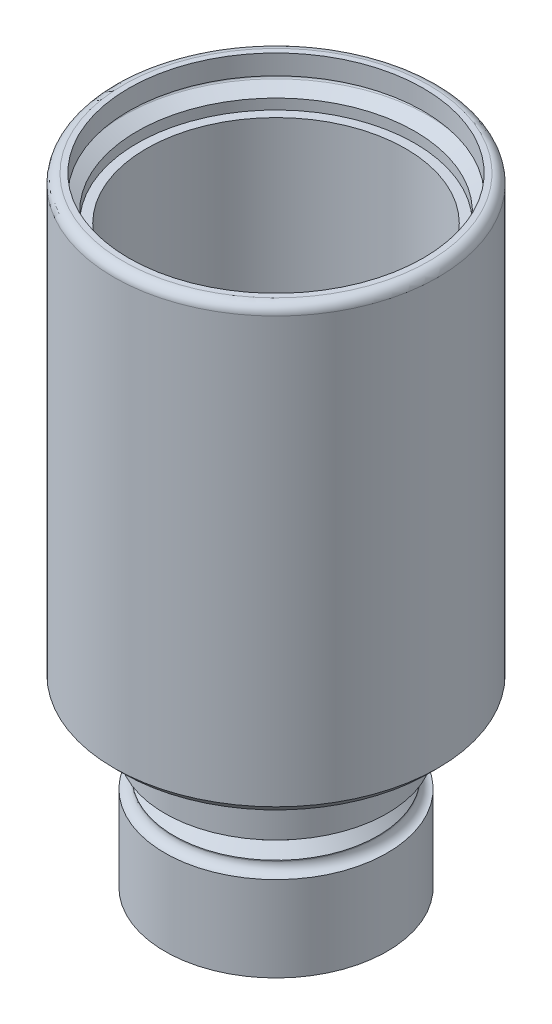
ISO-10303-21;
HEADER;
FILE_DESCRIPTION(('STEP AP214'),'2;1');
FILE_NAME('part.step','',(''),(''),'','','');
FILE_SCHEMA(('AUTOMOTIVE_DESIGN { 1 0 10303 214 1 1 1 1 }'));
ENDSEC;
DATA;
#1=APPLICATION_CONTEXT('core data for automotive mechanical design processes');
#2=APPLICATION_PROTOCOL_DEFINITION('international standard','automotive_design',2000,#1);
#3=PRODUCT_CONTEXT('',#1,'mechanical');
#4=PRODUCT('Part','Part','',(#3));
#5=PRODUCT_RELATED_PRODUCT_CATEGORY('part','',(#4));
#6=PRODUCT_DEFINITION_FORMATION('','',#4);
#7=PRODUCT_DEFINITION_CONTEXT('part definition',#1,'design');
#8=PRODUCT_DEFINITION('design','',#6,#7);
#9=PRODUCT_DEFINITION_SHAPE('','',#8);
#10=(LENGTH_UNIT() NAMED_UNIT(*) SI_UNIT(.MILLI.,.METRE.));
#11=(NAMED_UNIT(*) PLANE_ANGLE_UNIT() SI_UNIT($,.RADIAN.));
#12=(NAMED_UNIT(*) SI_UNIT($,.STERADIAN.) SOLID_ANGLE_UNIT());
#13=UNCERTAINTY_MEASURE_WITH_UNIT(LENGTH_MEASURE(1.E-05),#10,'distance_accuracy_value','');
#14=(GEOMETRIC_REPRESENTATION_CONTEXT(3) GLOBAL_UNCERTAINTY_ASSIGNED_CONTEXT((#13)) GLOBAL_UNIT_ASSIGNED_CONTEXT((#10,
#11,#12)) REPRESENTATION_CONTEXT('',''));
#15=CARTESIAN_POINT('',(0.,0.,0.));
#16=DIRECTION('',(0.,0.,1.));
#17=DIRECTION('',(1.,0.,0.));
#18=AXIS2_PLACEMENT_3D('',#15,#16,#17);
#19=CARTESIAN_POINT('',(-9.75,4.8,0.));
#20=DIRECTION('',(0.,1.,0.));
#21=DIRECTION('',(0.,0.,1.));
#22=AXIS2_PLACEMENT_3D('',#19,#20,#21);
#23=PLANE('',#22);
#24=CARTESIAN_POINT('',(0.,4.8,0.));
#25=DIRECTION('',(0.,1.,0.));
#26=DIRECTION('',(0.,0.,1.));
#27=AXIS2_PLACEMENT_3D('',#24,#25,#26);
#28=CIRCLE('',#27,9.35);
#29=CARTESIAN_POINT('',(0.,4.8,9.35));
#30=VERTEX_POINT('',#29);
#31=EDGE_CURVE('E106',#30,#30,#28,.F.);
#32=ORIENTED_EDGE('',*,*,#31,.T.);
#33=EDGE_LOOP('',(#32));
#34=FACE_BOUND('',#33,.T.);
#35=CARTESIAN_POINT('',(0.,4.8,0.));
#36=DIRECTION('',(0.,1.,0.));
#37=DIRECTION('',(0.,0.,1.));
#38=AXIS2_PLACEMENT_3D('',#35,#36,#37);
#39=CIRCLE('',#38,7.7);
#40=CARTESIAN_POINT('',(0.,4.8,7.7));
#41=VERTEX_POINT('',#40);
#42=EDGE_CURVE('E115',#41,#41,#39,.T.);
#43=ORIENTED_EDGE('',*,*,#42,.T.);
#44=EDGE_LOOP('',(#43));
#45=FACE_BOUND('',#44,.T.);
#46=ADVANCED_FACE('F35',(#34,#45),#23,.F.);
#47=CARTESIAN_POINT('',(0.,0.,0.));
#48=DIRECTION('',(0.,-1.,0.));
#49=DIRECTION('',(0.,0.,-1.));
#50=AXIS2_PLACEMENT_3D('',#47,#48,#49);
#51=CYLINDRICAL_SURFACE('',#50,7.5);
#52=CARTESIAN_POINT('',(0.,6.1,0.));
#53=DIRECTION('',(0.,-1.,0.));
#54=DIRECTION('',(0.,0.,-1.));
#55=AXIS2_PLACEMENT_3D('',#52,#53,#54);
#56=CIRCLE('',#55,7.5);
#57=CARTESIAN_POINT('',(0.,6.1,-7.5));
#58=VERTEX_POINT('',#57);
#59=EDGE_CURVE('E118',#58,#58,#56,.F.);
#60=ORIENTED_EDGE('',*,*,#59,.T.);
#61=EDGE_LOOP('',(#60));
#62=FACE_BOUND('',#61,.T.);
#63=CARTESIAN_POINT('',(0.,5.,0.));
#64=DIRECTION('',(0.,1.,0.));
#65=DIRECTION('',(0.,0.,1.));
#66=AXIS2_PLACEMENT_3D('',#63,#64,#65);
#67=CIRCLE('',#66,7.5);
#68=CARTESIAN_POINT('',(0.,5.,7.5));
#69=VERTEX_POINT('',#68);
#70=EDGE_CURVE('E121',#69,#69,#67,.F.);
#71=ORIENTED_EDGE('',*,*,#70,.T.);
#72=EDGE_LOOP('',(#71));
#73=FACE_BOUND('',#72,.T.);
#74=ADVANCED_FACE('F282',(#62,#73),#51,.F.);
#75=CARTESIAN_POINT('',(-7.5,6.3,0.));
#76=DIRECTION('',(0.,-1.,0.));
#77=DIRECTION('',(0.,0.,-1.));
#78=AXIS2_PLACEMENT_3D('',#75,#76,#77);
#79=PLANE('',#78);
#80=CARTESIAN_POINT('',(0.,6.3,0.));
#81=DIRECTION('',(0.,-1.,0.));
#82=DIRECTION('',(0.,0.,-1.));
#83=AXIS2_PLACEMENT_3D('',#80,#81,#82);
#84=CIRCLE('',#83,9.35);
#85=CARTESIAN_POINT('',(0.,6.3,-9.35));
#86=VERTEX_POINT('',#85);
#87=EDGE_CURVE('E88',#86,#86,#84,.F.);
#88=ORIENTED_EDGE('',*,*,#87,.T.);
#89=EDGE_LOOP('',(#88));
#90=FACE_BOUND('',#89,.T.);
#91=CARTESIAN_POINT('',(0.,6.3,0.));
#92=DIRECTION('',(0.,-1.,0.));
#93=DIRECTION('',(0.,0.,-1.));
#94=AXIS2_PLACEMENT_3D('',#91,#92,#93);
#95=CIRCLE('',#94,7.7);
#96=CARTESIAN_POINT('',(0.,6.3,-7.7));
#97=VERTEX_POINT('',#96);
#98=EDGE_CURVE('E124',#97,#97,#95,.T.);
#99=ORIENTED_EDGE('',*,*,#98,.T.);
#100=EDGE_LOOP('',(#99));
#101=FACE_BOUND('',#100,.T.);
#102=ADVANCED_FACE('F288',(#90,#101),#79,.F.);
#103=CARTESIAN_POINT('',(0.,0.,0.));
#104=DIRECTION('',(0.,-1.,0.));
#105=DIRECTION('',(0.,0.,-1.));
#106=AXIS2_PLACEMENT_3D('',#103,#104,#105);
#107=CYLINDRICAL_SURFACE('',#106,9.75);
#108=CARTESIAN_POINT('',(0.,6.7,0.));
#109=DIRECTION('',(0.,-1.,0.));
#110=DIRECTION('',(0.,0.,-1.));
#111=AXIS2_PLACEMENT_3D('',#108,#109,#110);
#112=CIRCLE('',#111,9.75);
#113=CARTESIAN_POINT('',(0.,6.7,-9.75));
#114=VERTEX_POINT('',#113);
#115=EDGE_CURVE('E91',#114,#114,#112,.T.);
#116=ORIENTED_EDGE('',*,*,#115,.T.);
#117=EDGE_LOOP('',(#116));
#118=FACE_BOUND('',#117,.T.);
#119=CARTESIAN_POINT('',(0.,8.9,0.));
#120=DIRECTION('',(0.,1.,0.));
#121=DIRECTION('',(0.,0.,1.));
#122=AXIS2_PLACEMENT_3D('',#119,#120,#121);
#123=CIRCLE('',#122,9.75);
#124=CARTESIAN_POINT('',(0.,8.9,9.75));
#125=VERTEX_POINT('',#124);
#126=EDGE_CURVE('E94',#125,#125,#123,.T.);
#127=ORIENTED_EDGE('',*,*,#126,.T.);
#128=EDGE_LOOP('',(#127));
#129=FACE_BOUND('',#128,.T.);
#130=ADVANCED_FACE('F420',(#118,#129),#107,.F.);
#131=CARTESIAN_POINT('',(-9.75,9.3,0.));
#132=DIRECTION('',(0.,1.,0.));
#133=DIRECTION('',(0.,0.,1.));
#134=AXIS2_PLACEMENT_3D('',#131,#132,#133);
#135=PLANE('',#134);
#136=CARTESIAN_POINT('',(0.,9.3,0.));
#137=DIRECTION('',(0.,1.,0.));
#138=DIRECTION('',(0.,0.,1.));
#139=AXIS2_PLACEMENT_3D('',#136,#137,#138);
#140=CIRCLE('',#139,9.35);
#141=CARTESIAN_POINT('',(0.,9.3,9.35));
#142=VERTEX_POINT('',#141);
#143=EDGE_CURVE('E85',#142,#142,#140,.F.);
#144=ORIENTED_EDGE('',*,*,#143,.T.);
#145=EDGE_LOOP('',(#144));
#146=FACE_BOUND('',#145,.T.);
#147=CARTESIAN_POINT('',(0.,9.3,0.));
#148=DIRECTION('',(0.,1.,0.));
#149=DIRECTION('',(0.,0.,1.));
#150=AXIS2_PLACEMENT_3D('',#147,#148,#149);
#151=CIRCLE('',#150,7.7);
#152=CARTESIAN_POINT('',(0.,9.3,7.7));
#153=VERTEX_POINT('',#152);
#154=EDGE_CURVE('E127',#153,#153,#151,.T.);
#155=ORIENTED_EDGE('',*,*,#154,.T.);
#156=EDGE_LOOP('',(#155));
#157=FACE_BOUND('',#156,.T.);
#158=ADVANCED_FACE('F416',(#146,#157),#135,.F.);
#159=CARTESIAN_POINT('',(0.,0.,0.));
#160=DIRECTION('',(0.,-1.,0.));
#161=DIRECTION('',(0.,0.,-1.));
#162=AXIS2_PLACEMENT_3D('',#159,#160,#161);
#163=CYLINDRICAL_SURFACE('',#162,7.5);
#164=CARTESIAN_POINT('',(0.,9.5,0.));
#165=DIRECTION('',(0.,1.,0.));
#166=DIRECTION('',(0.,0.,1.));
#167=AXIS2_PLACEMENT_3D('',#164,#165,#166);
#168=CIRCLE('',#167,7.5);
#169=CARTESIAN_POINT('',(0.,9.5,7.5));
#170=VERTEX_POINT('',#169);
#171=EDGE_CURVE('E130',#170,#170,#168,.F.);
#172=ORIENTED_EDGE('',*,*,#171,.T.);
#173=EDGE_LOOP('',(#172));
#174=FACE_BOUND('',#173,.T.);
#175=CARTESIAN_POINT('',(0.,10.4,0.));
#176=DIRECTION('',(0.,-1.,0.));
#177=DIRECTION('',(0.,0.,-1.));
#178=AXIS2_PLACEMENT_3D('',#175,#176,#177);
#179=CIRCLE('',#178,7.5);
#180=CARTESIAN_POINT('',(0.,10.4,-7.5));
#181=VERTEX_POINT('',#180);
#182=EDGE_CURVE('E145',#181,#181,#179,.T.);
#183=ORIENTED_EDGE('',*,*,#182,.F.);
#184=EDGE_LOOP('',(#183));
#185=FACE_BOUND('',#184,.T.);
#186=ADVANCED_FACE('F412',(#174,#185),#163,.F.);
#187=CARTESIAN_POINT('',(-7.5,10.4,0.));
#188=DIRECTION('',(0.,1.,0.));
#189=DIRECTION('',(0.,0.,1.));
#190=AXIS2_PLACEMENT_3D('',#187,#188,#189);
#191=PLANE('',#190);
#192=CARTESIAN_POINT('',(0.,10.4,0.));
#193=DIRECTION('',(0.,-1.,0.));
#194=DIRECTION('',(0.,0.,-1.));
#195=AXIS2_PLACEMENT_3D('',#192,#193,#194);
#196=CIRCLE('',#195,7.);
#197=CARTESIAN_POINT('',(0.,10.4,-7.));
#198=VERTEX_POINT('',#197);
#199=EDGE_CURVE('E148',#198,#198,#196,.T.);
#200=ORIENTED_EDGE('',*,*,#199,.F.);
#201=EDGE_LOOP('',(#200));
#202=FACE_BOUND('',#201,.T.);
#203=ORIENTED_EDGE('',*,*,#182,.T.);
#204=EDGE_LOOP('',(#203));
#205=FACE_BOUND('',#204,.T.);
#206=ADVANCED_FACE('F408',(#202,#205),#191,.F.);
#207=CARTESIAN_POINT('',(0.,0.,0.));
#208=DIRECTION('',(0.,-1.,0.));
#209=DIRECTION('',(0.,0.,-1.));
#210=AXIS2_PLACEMENT_3D('',#207,#208,#209);
#211=CYLINDRICAL_SURFACE('',#210,7.);
#212=CARTESIAN_POINT('',(0.,11.1,0.));
#213=DIRECTION('',(0.,-1.,0.));
#214=DIRECTION('',(0.,0.,-1.));
#215=AXIS2_PLACEMENT_3D('',#212,#213,#214);
#216=CIRCLE('',#215,7.);
#217=CARTESIAN_POINT('',(0.,11.1,-7.));
#218=VERTEX_POINT('',#217);
#219=EDGE_CURVE('E151',#218,#218,#216,.T.);
#220=ORIENTED_EDGE('',*,*,#219,.F.);
#221=EDGE_LOOP('',(#220));
#222=FACE_BOUND('',#221,.T.);
#223=ORIENTED_EDGE('',*,*,#199,.T.);
#224=EDGE_LOOP('',(#223));
#225=FACE_BOUND('',#224,.T.);
#226=ADVANCED_FACE('F404',(#222,#225),#211,.F.);
#227=CARTESIAN_POINT('',(0.,11.7,0.));
#228=DIRECTION('',(0.,-1.,0.));
#229=DIRECTION('',(0.,0.,-1.));
#230=AXIS2_PLACEMENT_3D('',#227,#228,#229);
#231=TOROIDAL_SURFACE('',#230,7.,0.6);
#232=CARTESIAN_POINT('',(0.,12.3,0.));
#233=DIRECTION('',(0.,-1.,0.));
#234=DIRECTION('',(0.,0.,-1.));
#235=AXIS2_PLACEMENT_3D('',#232,#233,#234);
#236=CIRCLE('',#235,7.);
#237=CARTESIAN_POINT('',(0.,12.3,-7.));
#238=VERTEX_POINT('',#237);
#239=EDGE_CURVE('E154',#238,#238,#236,.T.);
#240=ORIENTED_EDGE('',*,*,#239,.F.);
#241=EDGE_LOOP('',(#240));
#242=FACE_BOUND('',#241,.T.);
#243=ORIENTED_EDGE('',*,*,#219,.T.);
#244=EDGE_LOOP('',(#243));
#245=FACE_BOUND('',#244,.T.);
#246=ADVANCED_FACE('F400',(#242,#245),#231,.F.);
#247=CARTESIAN_POINT('',(0.,0.,0.));
#248=DIRECTION('',(0.,-1.,0.));
#249=DIRECTION('',(0.,0.,-1.));
#250=AXIS2_PLACEMENT_3D('',#247,#248,#249);
#251=CYLINDRICAL_SURFACE('',#250,7.);
#252=CARTESIAN_POINT('',(0.,15.4,0.));
#253=DIRECTION('',(0.,-1.,0.));
#254=DIRECTION('',(0.,0.,-1.));
#255=AXIS2_PLACEMENT_3D('',#252,#253,#254);
#256=CIRCLE('',#255,7.);
#257=CARTESIAN_POINT('',(0.,15.4,-7.));
#258=VERTEX_POINT('',#257);
#259=EDGE_CURVE('E157',#258,#258,#256,.T.);
#260=ORIENTED_EDGE('',*,*,#259,.F.);
#261=EDGE_LOOP('',(#260));
#262=FACE_BOUND('',#261,.T.);
#263=ORIENTED_EDGE('',*,*,#239,.T.);
#264=EDGE_LOOP('',(#263));
#265=FACE_BOUND('',#264,.T.);
#266=ADVANCED_FACE('F396',(#262,#265),#251,.F.);
#267=CARTESIAN_POINT('',(-7.,15.4,0.));
#268=DIRECTION('',(0.,1.,0.));
#269=DIRECTION('',(0.,0.,1.));
#270=AXIS2_PLACEMENT_3D('',#267,#268,#269);
#271=PLANE('',#270);
#272=CARTESIAN_POINT('',(0.,15.4,0.));
#273=DIRECTION('',(0.,-1.,0.));
#274=DIRECTION('',(0.,0.,-1.));
#275=AXIS2_PLACEMENT_3D('',#272,#273,#274);
#276=CIRCLE('',#275,6.);
#277=CARTESIAN_POINT('',(0.,15.4,-6.));
#278=VERTEX_POINT('',#277);
#279=EDGE_CURVE('E160',#278,#278,#276,.T.);
#280=ORIENTED_EDGE('',*,*,#279,.F.);
#281=EDGE_LOOP('',(#280));
#282=FACE_BOUND('',#281,.T.);
#283=ORIENTED_EDGE('',*,*,#259,.T.);
#284=EDGE_LOOP('',(#283));
#285=FACE_BOUND('',#284,.T.);
#286=ADVANCED_FACE('F392',(#282,#285),#271,.F.);
#287=CARTESIAN_POINT('',(0.,0.,0.));
#288=DIRECTION('',(0.,-1.,0.));
#289=DIRECTION('',(0.,0.,-1.));
#290=AXIS2_PLACEMENT_3D('',#287,#288,#289);
#291=CYLINDRICAL_SURFACE('',#290,6.);
#292=CARTESIAN_POINT('',(0.,17.4621778264911,0.));
#293=DIRECTION('',(0.,-1.,0.));
#294=DIRECTION('',(0.,0.,-1.));
#295=AXIS2_PLACEMENT_3D('',#292,#293,#294);
#296=CIRCLE('',#295,6.);
#297=CARTESIAN_POINT('',(0.,17.4621778264911,-6.));
#298=VERTEX_POINT('',#297);
#299=EDGE_CURVE('E163',#298,#298,#296,.T.);
#300=ORIENTED_EDGE('',*,*,#299,.F.);
#301=EDGE_LOOP('',(#300));
#302=FACE_BOUND('',#301,.T.);
#303=ORIENTED_EDGE('',*,*,#279,.T.);
#304=EDGE_LOOP('',(#303));
#305=FACE_BOUND('',#304,.T.);
#306=ADVANCED_FACE('F388',(#302,#305),#291,.F.);
#307=CARTESIAN_POINT('',(0.,17.4621778264911,0.));
#308=DIRECTION('',(0.,1.,0.));
#309=DIRECTION('',(0.,0.,1.));
#310=AXIS2_PLACEMENT_3D('',#307,#308,#309);
#311=CONICAL_SURFACE('',#310,6.,1.30899693899575);
#312=CARTESIAN_POINT('',(0.,18.4,0.));
#313=DIRECTION('',(0.,-1.,0.));
#314=DIRECTION('',(0.,0.,-1.));
#315=AXIS2_PLACEMENT_3D('',#312,#313,#314);
#316=CIRCLE('',#315,9.5);
#317=CARTESIAN_POINT('',(0.,18.4,-9.5));
#318=VERTEX_POINT('',#317);
#319=EDGE_CURVE('E166',#318,#318,#316,.T.);
#320=ORIENTED_EDGE('',*,*,#319,.F.);
#321=EDGE_LOOP('',(#320));
#322=FACE_BOUND('',#321,.T.);
#323=ORIENTED_EDGE('',*,*,#299,.T.);
#324=EDGE_LOOP('',(#323));
#325=FACE_BOUND('',#324,.T.);
#326=ADVANCED_FACE('F381',(#322,#325),#311,.F.);
#327=CARTESIAN_POINT('',(0.,0.,0.));
#328=DIRECTION('',(0.,-1.,0.));
#329=DIRECTION('',(0.,0.,-1.));
#330=AXIS2_PLACEMENT_3D('',#327,#328,#329);
#331=CYLINDRICAL_SURFACE('',#330,9.5);
#332=CARTESIAN_POINT('',(0.,31.9381197846483,0.));
#333=DIRECTION('',(0.,1.,0.));
#334=DIRECTION('',(0.,0.,1.));
#335=AXIS2_PLACEMENT_3D('',#332,#333,#334);
#336=CIRCLE('',#335,9.5);
#337=CARTESIAN_POINT('',(0.,31.9381197846483,9.5));
#338=VERTEX_POINT('',#337);
#339=EDGE_CURVE('E46',#338,#338,#336,.T.);
#340=ORIENTED_EDGE('',*,*,#339,.T.);
#341=EDGE_LOOP('',(#340));
#342=FACE_BOUND('',#341,.T.);
#343=ORIENTED_EDGE('',*,*,#319,.T.);
#344=EDGE_LOOP('',(#343));
#345=FACE_BOUND('',#344,.T.);
#346=ADVANCED_FACE('F371',(#342,#345),#331,.F.);
#347=CARTESIAN_POINT('',(0.,32.0535898384862,0.));
#348=DIRECTION('',(0.,1.,0.));
#349=DIRECTION('',(0.,0.,1.));
#350=AXIS2_PLACEMENT_3D('',#347,#348,#349);
#351=CONICAL_SURFACE('',#350,9.5,1.0471975511966);
#352=CARTESIAN_POINT('',(0.,32.342264973081,0.));
#353=DIRECTION('',(0.,1.,0.));
#354=DIRECTION('',(0.,0.,1.));
#355=AXIS2_PLACEMENT_3D('',#352,#353,#354);
#356=CIRCLE('',#355,10.);
#357=CARTESIAN_POINT('',(0.,32.342264973081,10.));
#358=VERTEX_POINT('',#357);
#359=EDGE_CURVE('E50',#358,#358,#356,.T.);
#360=ORIENTED_EDGE('',*,*,#359,.T.);
#361=EDGE_LOOP('',(#360));
#362=FACE_BOUND('',#361,.T.);
#363=CARTESIAN_POINT('',(0.,32.1113248654052,0.));
#364=DIRECTION('',(0.,-1.,0.));
#365=DIRECTION('',(0.,0.,-1.));
#366=AXIS2_PLACEMENT_3D('',#363,#364,#365);
#367=CIRCLE('',#366,9.6);
#368=CARTESIAN_POINT('',(0.,32.1113248654052,-9.6));
#369=VERTEX_POINT('',#368);
#370=EDGE_CURVE('E55',#369,#369,#367,.T.);
#371=ORIENTED_EDGE('',*,*,#370,.T.);
#372=EDGE_LOOP('',(#371));
#373=FACE_BOUND('',#372,.T.);
#374=ADVANCED_FACE('F368',(#362,#373),#351,.F.);
#375=CARTESIAN_POINT('',(0.,0.,0.));
#376=DIRECTION('',(0.,-1.,0.));
#377=DIRECTION('',(0.,0.,-1.));
#378=AXIS2_PLACEMENT_3D('',#375,#376,#377);
#379=CYLINDRICAL_SURFACE('',#378,10.1);
#380=CARTESIAN_POINT('',(0.,33.4,0.));
#381=DIRECTION('',(0.,1.,0.));
#382=DIRECTION('',(0.,0.,1.));
#383=AXIS2_PLACEMENT_3D('',#380,#381,#382);
#384=CIRCLE('',#383,10.1);
#385=CARTESIAN_POINT('',(0.,33.4,10.1));
#386=VERTEX_POINT('',#385);
#387=EDGE_CURVE('E58',#386,#386,#384,.T.);
#388=ORIENTED_EDGE('',*,*,#387,.T.);
#389=EDGE_LOOP('',(#388));
#390=FACE_BOUND('',#389,.T.);
#391=CARTESIAN_POINT('',(0.,32.5154700538379,0.));
#392=DIRECTION('',(0.,-1.,0.));
#393=DIRECTION('',(0.,0.,-1.));
#394=AXIS2_PLACEMENT_3D('',#391,#392,#393);
#395=CIRCLE('',#394,10.1);
#396=CARTESIAN_POINT('',(0.,32.5154700538379,-10.1));
#397=VERTEX_POINT('',#396);
#398=EDGE_CURVE('E61',#397,#397,#395,.T.);
#399=ORIENTED_EDGE('',*,*,#398,.T.);
#400=EDGE_LOOP('',(#399));
#401=FACE_BOUND('',#400,.T.);
#402=ADVANCED_FACE('F370',(#390,#401),#379,.F.);
#403=CARTESIAN_POINT('',(-10.1,33.6,0.));
#404=DIRECTION('',(0.,1.,0.));
#405=DIRECTION('',(0.,0.,1.));
#406=AXIS2_PLACEMENT_3D('',#403,#404,#405);
#407=PLANE('',#406);
#408=CARTESIAN_POINT('',(0.,33.6,0.));
#409=DIRECTION('',(0.,1.,0.));
#410=DIRECTION('',(0.,0.,1.));
#411=AXIS2_PLACEMENT_3D('',#408,#409,#410);
#412=CIRCLE('',#411,9.7);
#413=CARTESIAN_POINT('',(0.,33.6,9.7));
#414=VERTEX_POINT('',#413);
#415=EDGE_CURVE('E64',#414,#414,#412,.T.);
#416=ORIENTED_EDGE('',*,*,#415,.T.);
#417=EDGE_LOOP('',(#416));
#418=FACE_BOUND('',#417,.T.);
#419=CARTESIAN_POINT('',(0.,33.6,0.));
#420=DIRECTION('',(0.,1.,0.));
#421=DIRECTION('',(0.,0.,1.));
#422=AXIS2_PLACEMENT_3D('',#419,#420,#421);
#423=CIRCLE('',#422,9.9);
#424=CARTESIAN_POINT('',(0.,33.6,9.9));
#425=VERTEX_POINT('',#424);
#426=EDGE_CURVE('E67',#425,#425,#423,.F.);
#427=ORIENTED_EDGE('',*,*,#426,.T.);
#428=EDGE_LOOP('',(#427));
#429=FACE_BOUND('',#428,.T.);
#430=ADVANCED_FACE('F378',(#418,#429),#407,.F.);
#431=CARTESIAN_POINT('',(0.,0.,0.));
#432=DIRECTION('',(0.,-1.,0.));
#433=DIRECTION('',(0.,0.,-1.));
#434=AXIS2_PLACEMENT_3D('',#431,#432,#433);
#435=CYLINDRICAL_SURFACE('',#434,9.5);
#436=CARTESIAN_POINT('',(0.,35.2744871440515,0.));
#437=DIRECTION('',(0.,1.,0.));
#438=DIRECTION('',(0.,0.,1.));
#439=AXIS2_PLACEMENT_3D('',#436,#437,#438);
#440=CIRCLE('',#439,9.5);
#441=CARTESIAN_POINT('',(0.,35.2744871440515,9.5));
#442=VERTEX_POINT('',#441);
#443=EDGE_CURVE('E70',#442,#442,#440,.T.);
#444=ORIENTED_EDGE('',*,*,#443,.T.);
#445=EDGE_LOOP('',(#444));
#446=FACE_BOUND('',#445,.T.);
#447=CARTESIAN_POINT('',(0.,33.8,0.));
#448=DIRECTION('',(0.,1.,0.));
#449=DIRECTION('',(0.,0.,1.));
#450=AXIS2_PLACEMENT_3D('',#447,#448,#449);
#451=CIRCLE('',#450,9.5);
#452=CARTESIAN_POINT('',(0.,33.8,9.5));
#453=VERTEX_POINT('',#452);
#454=EDGE_CURVE('E73',#453,#453,#451,.F.);
#455=ORIENTED_EDGE('',*,*,#454,.T.);
#456=EDGE_LOOP('',(#455));
#457=FACE_BOUND('',#456,.T.);
#458=ADVANCED_FACE('F517',(#446,#457),#435,.F.);
#459=CARTESIAN_POINT('',(0.,35.2999303576517,0.));
#460=DIRECTION('',(0.,1.,0.));
#461=DIRECTION('',(0.,0.,1.));
#462=AXIS2_PLACEMENT_3D('',#459,#460,#461);
#463=CONICAL_SURFACE('',#462,9.5,0.253072741539172);
#464=CARTESIAN_POINT('',(0.,40.9500760008109,0.));
#465=DIRECTION('',(0.,-1.,0.));
#466=DIRECTION('',(0.,0.,-1.));
#467=AXIS2_PLACEMENT_3D('',#464,#465,#466);
#468=CIRCLE('',#467,10.9612270174927);
#469=CARTESIAN_POINT('',(0.,40.9500760008109,-10.9612270174927));
#470=VERTEX_POINT('',#469);
#471=EDGE_CURVE('E76',#470,#470,#468,.F.);
#472=ORIENTED_EDGE('',*,*,#471,.T.);
#473=EDGE_LOOP('',(#472));
#474=FACE_BOUND('',#473,.T.);
#475=CARTESIAN_POINT('',(0.,35.3245631448624,0.));
#476=DIRECTION('',(0.,-1.,0.));
#477=DIRECTION('',(0.,0.,-1.));
#478=AXIS2_PLACEMENT_3D('',#475,#476,#477);
#479=CIRCLE('',#478,9.50637047192438);
#480=CARTESIAN_POINT('',(0.,35.3245631448624,-9.50637047192438));
#481=VERTEX_POINT('',#480);
#482=EDGE_CURVE('E79',#481,#481,#479,.T.);
#483=ORIENTED_EDGE('',*,*,#482,.T.);
#484=EDGE_LOOP('',(#483));
#485=FACE_BOUND('',#484,.T.);
#486=ADVANCED_FACE('F526',(#474,#485),#463,.F.);
#487=CARTESIAN_POINT('',(-14.,41.1,0.));
#488=DIRECTION('',(0.,-1.,0.));
#489=DIRECTION('',(0.,0.,-1.));
#490=AXIS2_PLACEMENT_3D('',#487,#488,#489);
#491=PLANE('',#490);
#492=CARTESIAN_POINT('',(0.,41.1,0.));
#493=DIRECTION('',(0.,-1.,0.));
#494=DIRECTION('',(0.,0.,-1.));
#495=AXIS2_PLACEMENT_3D('',#492,#493,#494);
#496=CIRCLE('',#495,11.1548565455684);
#497=CARTESIAN_POINT('',(0.,41.1,-11.1548565455684));
#498=VERTEX_POINT('',#497);
#499=EDGE_CURVE('E82',#498,#498,#496,.T.);
#500=ORIENTED_EDGE('',*,*,#499,.T.);
#501=EDGE_LOOP('',(#500));
#502=FACE_BOUND('',#501,.T.);
#503=CARTESIAN_POINT('',(0.,41.1,0.));
#504=DIRECTION('',(0.,-1.,0.));
#505=DIRECTION('',(0.,0.,-1.));
#506=AXIS2_PLACEMENT_3D('',#503,#504,#505);
#507=CIRCLE('',#506,14.);
#508=CARTESIAN_POINT('',(0.,41.1,-14.));
#509=VERTEX_POINT('',#508);
#510=EDGE_CURVE('E169',#509,#509,#507,.T.);
#511=ORIENTED_EDGE('',*,*,#510,.F.);
#512=EDGE_LOOP('',(#511));
#513=FACE_BOUND('',#512,.T.);
#514=ADVANCED_FACE('F536',(#502,#513),#491,.F.);
#515=CARTESIAN_POINT('',(0.,0.,0.));
#516=DIRECTION('',(0.,-1.,0.));
#517=DIRECTION('',(0.,0.,-1.));
#518=AXIS2_PLACEMENT_3D('',#515,#516,#517);
#519=CYLINDRICAL_SURFACE('',#518,14.);
#520=CARTESIAN_POINT('',(0.,62.1,0.));
#521=DIRECTION('',(0.,-1.,0.));
#522=DIRECTION('',(0.,0.,-1.));
#523=AXIS2_PLACEMENT_3D('',#520,#521,#522);
#524=CIRCLE('',#523,14.);
#525=CARTESIAN_POINT('',(0.,62.1,-14.));
#526=VERTEX_POINT('',#525);
#527=EDGE_CURVE('E172',#526,#526,#524,.T.);
#528=ORIENTED_EDGE('',*,*,#527,.F.);
#529=EDGE_LOOP('',(#528));
#530=FACE_BOUND('',#529,.T.);
#531=ORIENTED_EDGE('',*,*,#510,.T.);
#532=EDGE_LOOP('',(#531));
#533=FACE_BOUND('',#532,.T.);
#534=ADVANCED_FACE('F546',(#530,#533),#519,.F.);
#535=CARTESIAN_POINT('',(-14.,62.1,0.));
#536=DIRECTION('',(0.,-1.,0.));
#537=DIRECTION('',(0.,0.,-1.));
#538=AXIS2_PLACEMENT_3D('',#535,#536,#537);
#539=PLANE('',#538);
#540=CARTESIAN_POINT('',(0.,62.1,0.));
#541=DIRECTION('',(0.,-1.,0.));
#542=DIRECTION('',(0.,0.,-1.));
#543=AXIS2_PLACEMENT_3D('',#540,#541,#542);
#544=CIRCLE('',#543,15.);
#545=CARTESIAN_POINT('',(0.,62.1,-15.));
#546=VERTEX_POINT('',#545);
#547=EDGE_CURVE('E175',#546,#546,#544,.T.);
#548=ORIENTED_EDGE('',*,*,#547,.F.);
#549=EDGE_LOOP('',(#548));
#550=FACE_BOUND('',#549,.T.);
#551=ORIENTED_EDGE('',*,*,#527,.T.);
#552=EDGE_LOOP('',(#551));
#553=FACE_BOUND('',#552,.T.);
#554=ADVANCED_FACE('F842',(#550,#553),#539,.F.);
#555=CARTESIAN_POINT('',(0.,0.,0.));
#556=DIRECTION('',(0.,-1.,0.));
#557=DIRECTION('',(0.,0.,-1.));
#558=AXIS2_PLACEMENT_3D('',#555,#556,#557);
#559=CYLINDRICAL_SURFACE('',#558,15.);
#560=CARTESIAN_POINT('',(0.,63.2185045423776,0.));
#561=DIRECTION('',(0.,-1.,0.));
#562=DIRECTION('',(0.,0.,-1.));
#563=AXIS2_PLACEMENT_3D('',#560,#561,#562);
#564=CIRCLE('',#563,15.);
#565=CARTESIAN_POINT('',(0.,63.2185045423776,-15.));
#566=VERTEX_POINT('',#565);
#567=EDGE_CURVE('E178',#566,#566,#564,.T.);
#568=ORIENTED_EDGE('',*,*,#567,.F.);
#569=EDGE_LOOP('',(#568));
#570=FACE_BOUND('',#569,.T.);
#571=ORIENTED_EDGE('',*,*,#547,.T.);
#572=EDGE_LOOP('',(#571));
#573=FACE_BOUND('',#572,.T.);
#574=ADVANCED_FACE('F832',(#570,#573),#559,.F.);
#575=CARTESIAN_POINT('',(0.,63.2185045423776,0.));
#576=DIRECTION('',(0.,1.,0.));
#577=DIRECTION('',(0.,0.,1.));
#578=AXIS2_PLACEMENT_3D('',#575,#576,#577);
#579=CONICAL_SURFACE('',#578,15.,1.0471975511966);
#580=CARTESIAN_POINT('',(0.,64.0267949192431,0.));
#581=DIRECTION('',(0.,-1.,0.));
#582=DIRECTION('',(0.,0.,-1.));
#583=AXIS2_PLACEMENT_3D('',#580,#581,#582);
#584=CIRCLE('',#583,16.4);
#585=CARTESIAN_POINT('',(0.,64.0267949192431,-16.4));
#586=VERTEX_POINT('',#585);
#587=EDGE_CURVE('E181',#586,#586,#584,.T.);
#588=ORIENTED_EDGE('',*,*,#587,.F.);
#589=EDGE_LOOP('',(#588));
#590=FACE_BOUND('',#589,.T.);
#591=ORIENTED_EDGE('',*,*,#567,.T.);
#592=EDGE_LOOP('',(#591));
#593=FACE_BOUND('',#592,.T.);
#594=ADVANCED_FACE('F822',(#590,#593),#579,.F.);
#595=CARTESIAN_POINT('',(0.,64.2,0.));
#596=DIRECTION('',(0.,-1.,0.));
#597=DIRECTION('',(0.,0.,-1.));
#598=AXIS2_PLACEMENT_3D('',#595,#596,#597);
#599=TOROIDAL_SURFACE('',#598,16.3,0.199999999999994);
#600=CARTESIAN_POINT('',(0.,64.3732050807569,0.));
#601=DIRECTION('',(0.,-1.,0.));
#602=DIRECTION('',(0.,0.,-1.));
#603=AXIS2_PLACEMENT_3D('',#600,#601,#602);
#604=CIRCLE('',#603,16.4);
#605=CARTESIAN_POINT('',(0.,64.3732050807569,-16.4));
#606=VERTEX_POINT('',#605);
#607=EDGE_CURVE('E184',#606,#606,#604,.T.);
#608=ORIENTED_EDGE('',*,*,#607,.F.);
#609=EDGE_LOOP('',(#608));
#610=FACE_BOUND('',#609,.T.);
#611=ORIENTED_EDGE('',*,*,#587,.T.);
#612=EDGE_LOOP('',(#611));
#613=FACE_BOUND('',#612,.T.);
#614=ADVANCED_FACE('F812',(#610,#613),#599,.F.);
#615=CARTESIAN_POINT('',(0.,64.3732050807569,0.));
#616=DIRECTION('',(0.,-1.,0.));
#617=DIRECTION('',(0.,0.,-1.));
#618=AXIS2_PLACEMENT_3D('',#615,#616,#617);
#619=CONICAL_SURFACE('',#618,16.4,1.0471975511966);
#620=CARTESIAN_POINT('',(0.,64.6618802153517,0.));
#621=DIRECTION('',(0.,-1.,0.));
#622=DIRECTION('',(0.,0.,-1.));
#623=AXIS2_PLACEMENT_3D('',#620,#621,#622);
#624=CIRCLE('',#623,15.9);
#625=CARTESIAN_POINT('',(0.,64.6618802153517,-15.9));
#626=VERTEX_POINT('',#625);
#627=EDGE_CURVE('E187',#626,#626,#624,.T.);
#628=ORIENTED_EDGE('',*,*,#627,.F.);
#629=EDGE_LOOP('',(#628));
#630=FACE_BOUND('',#629,.T.);
#631=ORIENTED_EDGE('',*,*,#607,.T.);
#632=EDGE_LOOP('',(#631));
#633=FACE_BOUND('',#632,.T.);
#634=ADVANCED_FACE('F802',(#630,#633),#619,.F.);
#635=CARTESIAN_POINT('',(0.,0.,0.));
#636=DIRECTION('',(0.,-1.,0.));
#637=DIRECTION('',(0.,0.,-1.));
#638=AXIS2_PLACEMENT_3D('',#635,#636,#637);
#639=CYLINDRICAL_SURFACE('',#638,15.9);
#640=CARTESIAN_POINT('',(0.,66.8,0.));
#641=DIRECTION('',(0.,-1.,0.));
#642=DIRECTION('',(0.,0.,-1.));
#643=AXIS2_PLACEMENT_3D('',#640,#641,#642);
#644=CIRCLE('',#643,15.9);
#645=CARTESIAN_POINT('',(0.,66.8,-15.9));
#646=VERTEX_POINT('',#645);
#647=EDGE_CURVE('E190',#646,#646,#644,.T.);
#648=ORIENTED_EDGE('',*,*,#647,.F.);
#649=EDGE_LOOP('',(#648));
#650=FACE_BOUND('',#649,.T.);
#651=ORIENTED_EDGE('',*,*,#627,.T.);
#652=EDGE_LOOP('',(#651));
#653=FACE_BOUND('',#652,.T.);
#654=ADVANCED_FACE('F593',(#650,#653),#639,.F.);
#655=CARTESIAN_POINT('',(-15.9,66.8,0.));
#656=DIRECTION('',(0.,-1.,0.));
#657=DIRECTION('',(0.,0.,-1.));
#658=AXIS2_PLACEMENT_3D('',#655,#656,#657);
#659=PLANE('',#658);
#660=CARTESIAN_POINT('',(0.,66.8,0.));
#661=DIRECTION('',(0.,-1.,0.));
#662=DIRECTION('',(0.,0.,-1.));
#663=AXIS2_PLACEMENT_3D('',#660,#661,#662);
#664=CIRCLE('',#663,16.5);
#665=CARTESIAN_POINT('',(0.,66.8,-16.5));
#666=VERTEX_POINT('',#665);
#667=EDGE_CURVE('E10',#666,#666,#664,.F.);
#668=ORIENTED_EDGE('',*,*,#667,.T.);
#669=EDGE_LOOP('',(#668));
#670=FACE_BOUND('',#669,.T.);
#671=ORIENTED_EDGE('',*,*,#647,.T.);
#672=EDGE_LOOP('',(#671));
#673=FACE_BOUND('',#672,.T.);
#674=ADVANCED_FACE('F279',(#670,#673),#659,.F.);
#675=CARTESIAN_POINT('',(0.,0.,0.));
#676=DIRECTION('',(0.,-1.,0.));
#677=DIRECTION('',(0.,0.,-1.));
#678=AXIS2_PLACEMENT_3D('',#675,#676,#677);
#679=CYLINDRICAL_SURFACE('',#678,17.5);
#680=CARTESIAN_POINT('',(0.,65.8,0.));
#681=DIRECTION('',(0.,-1.,0.));
#682=DIRECTION('',(0.,0.,-1.));
#683=AXIS2_PLACEMENT_3D('',#680,#681,#682);
#684=CIRCLE('',#683,17.5);
#685=CARTESIAN_POINT('',(0.,65.8,-17.5));
#686=VERTEX_POINT('',#685);
#687=EDGE_CURVE('E42',#686,#686,#684,.T.);
#688=ORIENTED_EDGE('',*,*,#687,.T.);
#689=EDGE_LOOP('',(#688));
#690=FACE_BOUND('',#689,.T.);
#691=CARTESIAN_POINT('',(0.,19.9,0.));
#692=DIRECTION('',(0.,1.,0.));
#693=DIRECTION('',(0.,0.,1.));
#694=AXIS2_PLACEMENT_3D('',#691,#692,#693);
#695=CIRCLE('',#694,17.5);
#696=CARTESIAN_POINT('',(0.,19.9,17.5));
#697=VERTEX_POINT('',#696);
#698=EDGE_CURVE('E139',#697,#697,#695,.T.);
#699=ORIENTED_EDGE('',*,*,#698,.T.);
#700=EDGE_LOOP('',(#699));
#701=FACE_BOUND('',#700,.T.);
#702=ADVANCED_FACE('F273',(#690,#701),#679,.T.);
#703=CARTESIAN_POINT('',(-17.5,18.9,0.));
#704=DIRECTION('',(0.,1.,0.));
#705=DIRECTION('',(0.,0.,1.));
#706=AXIS2_PLACEMENT_3D('',#703,#704,#705);
#707=PLANE('',#706);
#708=CARTESIAN_POINT('',(0.,18.9,0.));
#709=DIRECTION('',(0.,1.,0.));
#710=DIRECTION('',(0.,0.,1.));
#711=AXIS2_PLACEMENT_3D('',#708,#709,#710);
#712=CIRCLE('',#711,16.5);
#713=CARTESIAN_POINT('',(0.,18.9,16.5));
#714=VERTEX_POINT('',#713);
#715=EDGE_CURVE('E142',#714,#714,#712,.F.);
#716=ORIENTED_EDGE('',*,*,#715,.T.);
#717=EDGE_LOOP('',(#716));
#718=FACE_BOUND('',#717,.T.);
#719=CARTESIAN_POINT('',(0.,18.9,0.));
#720=DIRECTION('',(0.,-1.,0.));
#721=DIRECTION('',(0.,0.,-1.));
#722=AXIS2_PLACEMENT_3D('',#719,#720,#721);
#723=CIRCLE('',#722,13.0009181442321);
#724=CARTESIAN_POINT('',(0.,18.9,-13.0009181442321));
#725=VERTEX_POINT('',#724);
#726=EDGE_CURVE('E193',#725,#725,#723,.T.);
#727=ORIENTED_EDGE('',*,*,#726,.F.);
#728=EDGE_LOOP('',(#727));
#729=FACE_BOUND('',#728,.T.);
#730=ADVANCED_FACE('F268',(#718,#729),#707,.F.);
#731=CARTESIAN_POINT('',(0.,18.9,0.));
#732=DIRECTION('',(0.,1.,0.));
#733=DIRECTION('',(0.,0.,1.));
#734=AXIS2_PLACEMENT_3D('',#731,#732,#733);
#735=CONICAL_SURFACE('',#734,13.0009181442321,0.349065850398867);
#736=CARTESIAN_POINT('',(0.,16.15,0.));
#737=DIRECTION('',(0.,-1.,0.));
#738=DIRECTION('',(0.,0.,-1.));
#739=AXIS2_PLACEMENT_3D('',#736,#737,#738);
#740=CIRCLE('',#739,12.);
#741=CARTESIAN_POINT('',(0.,16.15,-12.));
#742=VERTEX_POINT('',#741);
#743=EDGE_CURVE('E196',#742,#742,#740,.T.);
#744=ORIENTED_EDGE('',*,*,#743,.F.);
#745=EDGE_LOOP('',(#744));
#746=FACE_BOUND('',#745,.T.);
#747=ORIENTED_EDGE('',*,*,#726,.T.);
#748=EDGE_LOOP('',(#747));
#749=FACE_BOUND('',#748,.T.);
#750=ADVANCED_FACE('F262',(#746,#749),#735,.T.);
#751=CARTESIAN_POINT('',(0.,0.,0.));
#752=DIRECTION('',(0.,-1.,0.));
#753=DIRECTION('',(0.,0.,-1.));
#754=AXIS2_PLACEMENT_3D('',#751,#752,#753);
#755=CYLINDRICAL_SURFACE('',#754,12.);
#756=CARTESIAN_POINT('',(0.,12.9,0.));
#757=DIRECTION('',(0.,-1.,0.));
#758=DIRECTION('',(0.,0.,-1.));
#759=AXIS2_PLACEMENT_3D('',#756,#757,#758);
#760=CIRCLE('',#759,12.);
#761=CARTESIAN_POINT('',(0.,12.9,-12.));
#762=VERTEX_POINT('',#761);
#763=EDGE_CURVE('E199',#762,#762,#760,.T.);
#764=ORIENTED_EDGE('',*,*,#763,.F.);
#765=EDGE_LOOP('',(#764));
#766=FACE_BOUND('',#765,.T.);
#767=ORIENTED_EDGE('',*,*,#743,.T.);
#768=EDGE_LOOP('',(#767));
#769=FACE_BOUND('',#768,.T.);
#770=ADVANCED_FACE('F256',(#766,#769),#755,.T.);
#771=CARTESIAN_POINT('',(-12.,12.9,0.));
#772=DIRECTION('',(0.,1.,0.));
#773=DIRECTION('',(0.,0.,1.));
#774=AXIS2_PLACEMENT_3D('',#771,#772,#773);
#775=PLANE('',#774);
#776=CARTESIAN_POINT('',(0.,12.9,0.));
#777=DIRECTION('',(0.,-1.,0.));
#778=DIRECTION('',(0.,0.,-1.));
#779=AXIS2_PLACEMENT_3D('',#776,#777,#778);
#780=CIRCLE('',#779,9.9);
#781=CARTESIAN_POINT('',(0.,12.9,-9.9));
#782=VERTEX_POINT('',#781);
#783=EDGE_CURVE('E202',#782,#782,#780,.T.);
#784=ORIENTED_EDGE('',*,*,#783,.F.);
#785=EDGE_LOOP('',(#784));
#786=FACE_BOUND('',#785,.T.);
#787=ORIENTED_EDGE('',*,*,#763,.T.);
#788=EDGE_LOOP('',(#787));
#789=FACE_BOUND('',#788,.T.);
#790=ADVANCED_FACE('F250',(#786,#789),#775,.F.);
#791=CARTESIAN_POINT('',(0.,0.,0.));
#792=DIRECTION('',(0.,-1.,0.));
#793=DIRECTION('',(0.,0.,-1.));
#794=AXIS2_PLACEMENT_3D('',#791,#792,#793);
#795=CYLINDRICAL_SURFACE('',#794,9.9);
#796=CARTESIAN_POINT('',(0.,11.4,0.));
#797=DIRECTION('',(0.,-1.,0.));
#798=DIRECTION('',(0.,0.,-1.));
#799=AXIS2_PLACEMENT_3D('',#796,#797,#798);
#800=CIRCLE('',#799,9.9);
#801=CARTESIAN_POINT('',(0.,11.4,-9.9));
#802=VERTEX_POINT('',#801);
#803=EDGE_CURVE('E205',#802,#802,#800,.T.);
#804=ORIENTED_EDGE('',*,*,#803,.F.);
#805=EDGE_LOOP('',(#804));
#806=FACE_BOUND('',#805,.T.);
#807=ORIENTED_EDGE('',*,*,#783,.T.);
#808=EDGE_LOOP('',(#807));
#809=FACE_BOUND('',#808,.T.);
#810=ADVANCED_FACE('F244',(#806,#809),#795,.T.);
#811=CARTESIAN_POINT('',(0.,11.4,0.));
#812=DIRECTION('',(0.,-1.,0.));
#813=DIRECTION('',(0.,0.,-1.));
#814=AXIS2_PLACEMENT_3D('',#811,#812,#813);
#815=CONICAL_SURFACE('',#814,9.9,0.785398163397451);
#816=CARTESIAN_POINT('',(0.,10.3,0.));
#817=DIRECTION('',(0.,-1.,0.));
#818=DIRECTION('',(0.,0.,-1.));
#819=AXIS2_PLACEMENT_3D('',#816,#817,#818);
#820=CIRCLE('',#819,11.);
#821=CARTESIAN_POINT('',(0.,10.3,-11.));
#822=VERTEX_POINT('',#821);
#823=EDGE_CURVE('E208',#822,#822,#820,.T.);
#824=ORIENTED_EDGE('',*,*,#823,.F.);
#825=EDGE_LOOP('',(#824));
#826=FACE_BOUND('',#825,.T.);
#827=ORIENTED_EDGE('',*,*,#803,.T.);
#828=EDGE_LOOP('',(#827));
#829=FACE_BOUND('',#828,.T.);
#830=ADVANCED_FACE('F238',(#826,#829),#815,.T.);
#831=CARTESIAN_POINT('',(0.,0.,0.));
#832=DIRECTION('',(0.,-1.,0.));
#833=DIRECTION('',(0.,0.,-1.));
#834=AXIS2_PLACEMENT_3D('',#831,#832,#833);
#835=CYLINDRICAL_SURFACE('',#834,11.);
#836=CARTESIAN_POINT('',(0.,10.2,0.));
#837=DIRECTION('',(0.,-1.,0.));
#838=DIRECTION('',(0.,0.,-1.));
#839=AXIS2_PLACEMENT_3D('',#836,#837,#838);
#840=CIRCLE('',#839,11.);
#841=CARTESIAN_POINT('',(0.,10.2,-11.));
#842=VERTEX_POINT('',#841);
#843=EDGE_CURVE('E211',#842,#842,#840,.T.);
#844=ORIENTED_EDGE('',*,*,#843,.F.);
#845=EDGE_LOOP('',(#844));
#846=FACE_BOUND('',#845,.T.);
#847=ORIENTED_EDGE('',*,*,#823,.T.);
#848=EDGE_LOOP('',(#847));
#849=FACE_BOUND('',#848,.T.);
#850=ADVANCED_FACE('F232',(#846,#849),#835,.T.);
#851=CARTESIAN_POINT('',(0.,10.2,0.));
#852=DIRECTION('',(0.,-1.,0.));
#853=DIRECTION('',(0.,0.,-1.));
#854=AXIS2_PLACEMENT_3D('',#851,#852,#853);
#855=TOROIDAL_SURFACE('',#854,12.,1.);
#856=CARTESIAN_POINT('',(0.,9.2,0.));
#857=DIRECTION('',(0.,-1.,0.));
#858=DIRECTION('',(0.,0.,-1.));
#859=AXIS2_PLACEMENT_3D('',#856,#857,#858);
#860=CIRCLE('',#859,12.);
#861=CARTESIAN_POINT('',(0.,9.2,-12.));
#862=VERTEX_POINT('',#861);
#863=EDGE_CURVE('E214',#862,#862,#860,.T.);
#864=ORIENTED_EDGE('',*,*,#863,.F.);
#865=EDGE_LOOP('',(#864));
#866=FACE_BOUND('',#865,.T.);
#867=ORIENTED_EDGE('',*,*,#843,.T.);
#868=EDGE_LOOP('',(#867));
#869=FACE_BOUND('',#868,.T.);
#870=ADVANCED_FACE('F226',(#866,#869),#855,.F.);
#871=CARTESIAN_POINT('',(0.,0.,0.));
#872=DIRECTION('',(0.,-1.,0.));
#873=DIRECTION('',(0.,0.,-1.));
#874=AXIS2_PLACEMENT_3D('',#871,#872,#873);
#875=CYLINDRICAL_SURFACE('',#874,12.);
#876=CARTESIAN_POINT('',(0.,0.,0.));
#877=DIRECTION('',(0.,-1.,0.));
#878=DIRECTION('',(0.,0.,-1.));
#879=AXIS2_PLACEMENT_3D('',#876,#877,#878);
#880=CIRCLE('',#879,12.);
#881=CARTESIAN_POINT('',(0.,0.,-12.));
#882=VERTEX_POINT('',#881);
#883=EDGE_CURVE('E217',#882,#882,#880,.T.);
#884=ORIENTED_EDGE('',*,*,#883,.F.);
#885=EDGE_LOOP('',(#884));
#886=FACE_BOUND('',#885,.T.);
#887=ORIENTED_EDGE('',*,*,#863,.T.);
#888=EDGE_LOOP('',(#887));
#889=FACE_BOUND('',#888,.T.);
#890=ADVANCED_FACE('F223',(#886,#889),#875,.T.);
#891=CARTESIAN_POINT('',(-12.,0.,0.));
#892=DIRECTION('',(0.,1.,0.));
#893=DIRECTION('',(0.,0.,1.));
#894=AXIS2_PLACEMENT_3D('',#891,#892,#893);
#895=PLANE('',#894);
#896=CARTESIAN_POINT('',(0.,0.,0.));
#897=DIRECTION('',(0.,1.,0.));
#898=DIRECTION('',(0.,0.,1.));
#899=AXIS2_PLACEMENT_3D('',#896,#897,#898);
#900=CIRCLE('',#899,8.);
#901=CARTESIAN_POINT('',(0.,0.,8.));
#902=VERTEX_POINT('',#901);
#903=EDGE_CURVE('E133',#902,#902,#900,.T.);
#904=ORIENTED_EDGE('',*,*,#903,.T.);
#905=EDGE_LOOP('',(#904));
#906=FACE_BOUND('',#905,.T.);
#907=ORIENTED_EDGE('',*,*,#883,.T.);
#908=EDGE_LOOP('',(#907));
#909=FACE_BOUND('',#908,.T.);
#910=ADVANCED_FACE('F221',(#906,#909),#895,.F.);
#911=CARTESIAN_POINT('',(0.,0.,0.));
#912=DIRECTION('',(0.,-1.,0.));
#913=DIRECTION('',(0.,0.,-1.));
#914=AXIS2_PLACEMENT_3D('',#911,#912,#913);
#915=CYLINDRICAL_SURFACE('',#914,7.5);
#916=CARTESIAN_POINT('',(0.,1.6,0.));
#917=DIRECTION('',(0.,-1.,0.));
#918=DIRECTION('',(0.,0.,-1.));
#919=AXIS2_PLACEMENT_3D('',#916,#917,#918);
#920=CIRCLE('',#919,7.5);
#921=CARTESIAN_POINT('',(0.,1.6,-7.5));
#922=VERTEX_POINT('',#921);
#923=EDGE_CURVE('E109',#922,#922,#920,.F.);
#924=ORIENTED_EDGE('',*,*,#923,.T.);
#925=EDGE_LOOP('',(#924));
#926=FACE_BOUND('',#925,.T.);
#927=CARTESIAN_POINT('',(0.,0.5,0.));
#928=DIRECTION('',(0.,1.,0.));
#929=DIRECTION('',(0.,0.,1.));
#930=AXIS2_PLACEMENT_3D('',#927,#928,#929);
#931=CIRCLE('',#930,7.5);
#932=CARTESIAN_POINT('',(0.,0.5,7.5));
#933=VERTEX_POINT('',#932);
#934=EDGE_CURVE('E136',#933,#933,#931,.F.);
#935=ORIENTED_EDGE('',*,*,#934,.T.);
#936=EDGE_LOOP('',(#935));
#937=FACE_BOUND('',#936,.T.);
#938=ADVANCED_FACE('F662',(#926,#937),#915,.F.);
#939=CARTESIAN_POINT('',(-7.5,1.8,0.));
#940=DIRECTION('',(0.,-1.,0.));
#941=DIRECTION('',(0.,0.,-1.));
#942=AXIS2_PLACEMENT_3D('',#939,#940,#941);
#943=PLANE('',#942);
#944=CARTESIAN_POINT('',(0.,1.8,0.));
#945=DIRECTION('',(0.,-1.,0.));
#946=DIRECTION('',(0.,0.,-1.));
#947=AXIS2_PLACEMENT_3D('',#944,#945,#946);
#948=CIRCLE('',#947,9.35);
#949=CARTESIAN_POINT('',(0.,1.8,-9.35));
#950=VERTEX_POINT('',#949);
#951=EDGE_CURVE('E97',#950,#950,#948,.F.);
#952=ORIENTED_EDGE('',*,*,#951,.T.);
#953=EDGE_LOOP('',(#952));
#954=FACE_BOUND('',#953,.T.);
#955=CARTESIAN_POINT('',(0.,1.8,0.));
#956=DIRECTION('',(0.,-1.,0.));
#957=DIRECTION('',(0.,0.,-1.));
#958=AXIS2_PLACEMENT_3D('',#955,#956,#957);
#959=CIRCLE('',#958,7.7);
#960=CARTESIAN_POINT('',(0.,1.8,-7.7));
#961=VERTEX_POINT('',#960);
#962=EDGE_CURVE('E112',#961,#961,#959,.T.);
#963=ORIENTED_EDGE('',*,*,#962,.T.);
#964=EDGE_LOOP('',(#963));
#965=FACE_BOUND('',#964,.T.);
#966=ADVANCED_FACE('F671',(#954,#965),#943,.F.);
#967=CARTESIAN_POINT('',(0.,0.,0.));
#968=DIRECTION('',(0.,-1.,0.));
#969=DIRECTION('',(0.,0.,-1.));
#970=AXIS2_PLACEMENT_3D('',#967,#968,#969);
#971=CYLINDRICAL_SURFACE('',#970,9.75);
#972=CARTESIAN_POINT('',(0.,4.4,0.));
#973=DIRECTION('',(0.,1.,0.));
#974=DIRECTION('',(0.,0.,1.));
#975=AXIS2_PLACEMENT_3D('',#972,#973,#974);
#976=CIRCLE('',#975,9.75);
#977=CARTESIAN_POINT('',(0.,4.4,9.75));
#978=VERTEX_POINT('',#977);
#979=EDGE_CURVE('E100',#978,#978,#976,.T.);
#980=ORIENTED_EDGE('',*,*,#979,.T.);
#981=EDGE_LOOP('',(#980));
#982=FACE_BOUND('',#981,.T.);
#983=CARTESIAN_POINT('',(0.,2.2,0.));
#984=DIRECTION('',(0.,-1.,0.));
#985=DIRECTION('',(0.,0.,-1.));
#986=AXIS2_PLACEMENT_3D('',#983,#984,#985);
#987=CIRCLE('',#986,9.75);
#988=CARTESIAN_POINT('',(0.,2.2,-9.75));
#989=VERTEX_POINT('',#988);
#990=EDGE_CURVE('E103',#989,#989,#987,.T.);
#991=ORIENTED_EDGE('',*,*,#990,.T.);
#992=EDGE_LOOP('',(#991));
#993=FACE_BOUND('',#992,.T.);
#994=ADVANCED_FACE('F301',(#982,#993),#971,.F.);
#995=CARTESIAN_POINT('',(0.,18.9,0.));
#996=DIRECTION('',(0.,1.,0.));
#997=DIRECTION('',(0.,0.,1.));
#998=AXIS2_PLACEMENT_3D('',#995,#996,#997);
#999=CONICAL_SURFACE('',#998,16.5,0.785398163397447);
#1000=ORIENTED_EDGE('',*,*,#698,.F.);
#1001=EDGE_LOOP('',(#1000));
#1002=FACE_BOUND('',#1001,.T.);
#1003=ORIENTED_EDGE('',*,*,#715,.F.);
#1004=EDGE_LOOP('',(#1003));
#1005=FACE_BOUND('',#1004,.T.);
#1006=ADVANCED_FACE('F295',(#1002,#1005),#999,.T.);
#1007=CARTESIAN_POINT('',(0.,0.5,0.));
#1008=DIRECTION('',(0.,1.,0.));
#1009=DIRECTION('',(0.,0.,1.));
#1010=AXIS2_PLACEMENT_3D('',#1007,#1008,#1009);
#1011=TOROIDAL_SURFACE('',#1010,8.,0.5);
#1012=ORIENTED_EDGE('',*,*,#903,.F.);
#1013=EDGE_LOOP('',(#1012));
#1014=FACE_BOUND('',#1013,.T.);
#1015=ORIENTED_EDGE('',*,*,#934,.F.);
#1016=EDGE_LOOP('',(#1015));
#1017=FACE_BOUND('',#1016,.T.);
#1018=ADVANCED_FACE('F300',(#1014,#1017),#1011,.T.);
#1019=CARTESIAN_POINT('',(0.,9.5,0.));
#1020=DIRECTION('',(0.,1.,0.));
#1021=DIRECTION('',(0.,0.,1.));
#1022=AXIS2_PLACEMENT_3D('',#1019,#1020,#1021);
#1023=TOROIDAL_SURFACE('',#1022,7.7,0.2);
#1024=ORIENTED_EDGE('',*,*,#154,.F.);
#1025=EDGE_LOOP('',(#1024));
#1026=FACE_BOUND('',#1025,.T.);
#1027=ORIENTED_EDGE('',*,*,#171,.F.);
#1028=EDGE_LOOP('',(#1027));
#1029=FACE_BOUND('',#1028,.T.);
#1030=ADVANCED_FACE('F305',(#1026,#1029),#1023,.T.);
#1031=CARTESIAN_POINT('',(0.,6.1,0.));
#1032=DIRECTION('',(0.,-1.,0.));
#1033=DIRECTION('',(0.,0.,-1.));
#1034=AXIS2_PLACEMENT_3D('',#1031,#1032,#1033);
#1035=TOROIDAL_SURFACE('',#1034,7.7,0.2);
#1036=ORIENTED_EDGE('',*,*,#59,.F.);
#1037=EDGE_LOOP('',(#1036));
#1038=FACE_BOUND('',#1037,.T.);
#1039=ORIENTED_EDGE('',*,*,#98,.F.);
#1040=EDGE_LOOP('',(#1039));
#1041=FACE_BOUND('',#1040,.T.);
#1042=ADVANCED_FACE('F309',(#1038,#1041),#1035,.T.);
#1043=CARTESIAN_POINT('',(0.,5.,0.));
#1044=DIRECTION('',(0.,1.,0.));
#1045=DIRECTION('',(0.,0.,1.));
#1046=AXIS2_PLACEMENT_3D('',#1043,#1044,#1045);
#1047=TOROIDAL_SURFACE('',#1046,7.7,0.2);
#1048=ORIENTED_EDGE('',*,*,#42,.F.);
#1049=EDGE_LOOP('',(#1048));
#1050=FACE_BOUND('',#1049,.T.);
#1051=ORIENTED_EDGE('',*,*,#70,.F.);
#1052=EDGE_LOOP('',(#1051));
#1053=FACE_BOUND('',#1052,.T.);
#1054=ADVANCED_FACE('F313',(#1050,#1053),#1047,.T.);
#1055=CARTESIAN_POINT('',(0.,1.6,0.));
#1056=DIRECTION('',(0.,-1.,0.));
#1057=DIRECTION('',(0.,0.,-1.));
#1058=AXIS2_PLACEMENT_3D('',#1055,#1056,#1057);
#1059=TOROIDAL_SURFACE('',#1058,7.7,0.2);
#1060=ORIENTED_EDGE('',*,*,#923,.F.);
#1061=EDGE_LOOP('',(#1060));
#1062=FACE_BOUND('',#1061,.T.);
#1063=ORIENTED_EDGE('',*,*,#962,.F.);
#1064=EDGE_LOOP('',(#1063));
#1065=FACE_BOUND('',#1064,.T.);
#1066=ADVANCED_FACE('F317',(#1062,#1065),#1059,.T.);
#1067=CARTESIAN_POINT('',(0.,4.4,0.));
#1068=DIRECTION('',(0.,1.,0.));
#1069=DIRECTION('',(0.,0.,1.));
#1070=AXIS2_PLACEMENT_3D('',#1067,#1068,#1069);
#1071=TOROIDAL_SURFACE('',#1070,9.35,0.4);
#1072=ORIENTED_EDGE('',*,*,#979,.F.);
#1073=EDGE_LOOP('',(#1072));
#1074=FACE_BOUND('',#1073,.T.);
#1075=ORIENTED_EDGE('',*,*,#31,.F.);
#1076=EDGE_LOOP('',(#1075));
#1077=FACE_BOUND('',#1076,.T.);
#1078=ADVANCED_FACE('F321',(#1074,#1077),#1071,.F.);
#1079=CARTESIAN_POINT('',(0.,2.2,0.));
#1080=DIRECTION('',(0.,-1.,0.));
#1081=DIRECTION('',(0.,0.,-1.));
#1082=AXIS2_PLACEMENT_3D('',#1079,#1080,#1081);
#1083=TOROIDAL_SURFACE('',#1082,9.35,0.4);
#1084=ORIENTED_EDGE('',*,*,#951,.F.);
#1085=EDGE_LOOP('',(#1084));
#1086=FACE_BOUND('',#1085,.T.);
#1087=ORIENTED_EDGE('',*,*,#990,.F.);
#1088=EDGE_LOOP('',(#1087));
#1089=FACE_BOUND('',#1088,.T.);
#1090=ADVANCED_FACE('F325',(#1086,#1089),#1083,.F.);
#1091=CARTESIAN_POINT('',(0.,6.7,0.));
#1092=DIRECTION('',(0.,-1.,0.));
#1093=DIRECTION('',(0.,0.,-1.));
#1094=AXIS2_PLACEMENT_3D('',#1091,#1092,#1093);
#1095=TOROIDAL_SURFACE('',#1094,9.35,0.4);
#1096=ORIENTED_EDGE('',*,*,#87,.F.);
#1097=EDGE_LOOP('',(#1096));
#1098=FACE_BOUND('',#1097,.T.);
#1099=ORIENTED_EDGE('',*,*,#115,.F.);
#1100=EDGE_LOOP('',(#1099));
#1101=FACE_BOUND('',#1100,.T.);
#1102=ADVANCED_FACE('F329',(#1098,#1101),#1095,.F.);
#1103=CARTESIAN_POINT('',(0.,8.9,0.));
#1104=DIRECTION('',(0.,1.,0.));
#1105=DIRECTION('',(0.,0.,1.));
#1106=AXIS2_PLACEMENT_3D('',#1103,#1104,#1105);
#1107=TOROIDAL_SURFACE('',#1106,9.35,0.4);
#1108=ORIENTED_EDGE('',*,*,#126,.F.);
#1109=EDGE_LOOP('',(#1108));
#1110=FACE_BOUND('',#1109,.T.);
#1111=ORIENTED_EDGE('',*,*,#143,.F.);
#1112=EDGE_LOOP('',(#1111));
#1113=FACE_BOUND('',#1112,.T.);
#1114=ADVANCED_FACE('F333',(#1110,#1113),#1107,.F.);
#1115=CARTESIAN_POINT('',(0.,40.9,0.));
#1116=DIRECTION('',(0.,-1.,0.));
#1117=DIRECTION('',(0.,0.,-1.));
#1118=AXIS2_PLACEMENT_3D('',#1115,#1116,#1117);
#1119=TOROIDAL_SURFACE('',#1118,11.1548565455684,0.2);
#1120=ORIENTED_EDGE('',*,*,#471,.F.);
#1121=EDGE_LOOP('',(#1120));
#1122=FACE_BOUND('',#1121,.T.);
#1123=ORIENTED_EDGE('',*,*,#499,.F.);
#1124=EDGE_LOOP('',(#1123));
#1125=FACE_BOUND('',#1124,.T.);
#1126=ADVANCED_FACE('F337',(#1122,#1125),#1119,.T.);
#1127=CARTESIAN_POINT('',(0.,35.2744871440515,0.));
#1128=DIRECTION('',(0.,1.,0.));
#1129=DIRECTION('',(0.,0.,1.));
#1130=AXIS2_PLACEMENT_3D('',#1127,#1128,#1129);
#1131=TOROIDAL_SURFACE('',#1130,9.7,0.2);
#1132=ORIENTED_EDGE('',*,*,#443,.F.);
#1133=EDGE_LOOP('',(#1132));
#1134=FACE_BOUND('',#1133,.T.);
#1135=ORIENTED_EDGE('',*,*,#482,.F.);
#1136=EDGE_LOOP('',(#1135));
#1137=FACE_BOUND('',#1136,.T.);
#1138=ADVANCED_FACE('F341',(#1134,#1137),#1131,.T.);
#1139=CARTESIAN_POINT('',(0.,33.8,0.));
#1140=DIRECTION('',(0.,1.,0.));
#1141=DIRECTION('',(0.,0.,1.));
#1142=AXIS2_PLACEMENT_3D('',#1139,#1140,#1141);
#1143=TOROIDAL_SURFACE('',#1142,9.7,0.2);
#1144=ORIENTED_EDGE('',*,*,#415,.F.);
#1145=EDGE_LOOP('',(#1144));
#1146=FACE_BOUND('',#1145,.T.);
#1147=ORIENTED_EDGE('',*,*,#454,.F.);
#1148=EDGE_LOOP('',(#1147));
#1149=FACE_BOUND('',#1148,.T.);
#1150=ADVANCED_FACE('F345',(#1146,#1149),#1143,.T.);
#1151=CARTESIAN_POINT('',(0.,33.4,0.));
#1152=DIRECTION('',(0.,1.,0.));
#1153=DIRECTION('',(0.,0.,1.));
#1154=AXIS2_PLACEMENT_3D('',#1151,#1152,#1153);
#1155=TOROIDAL_SURFACE('',#1154,9.9,0.2);
#1156=ORIENTED_EDGE('',*,*,#387,.F.);
#1157=EDGE_LOOP('',(#1156));
#1158=FACE_BOUND('',#1157,.T.);
#1159=ORIENTED_EDGE('',*,*,#426,.F.);
#1160=EDGE_LOOP('',(#1159));
#1161=FACE_BOUND('',#1160,.T.);
#1162=ADVANCED_FACE('F349',(#1158,#1161),#1155,.F.);
#1163=CARTESIAN_POINT('',(0.,32.5154700538379,0.));
#1164=DIRECTION('',(0.,-1.,0.));
#1165=DIRECTION('',(0.,0.,-1.));
#1166=AXIS2_PLACEMENT_3D('',#1163,#1164,#1165);
#1167=TOROIDAL_SURFACE('',#1166,9.9,0.2);
#1168=ORIENTED_EDGE('',*,*,#359,.F.);
#1169=EDGE_LOOP('',(#1168));
#1170=FACE_BOUND('',#1169,.T.);
#1171=ORIENTED_EDGE('',*,*,#398,.F.);
#1172=EDGE_LOOP('',(#1171));
#1173=FACE_BOUND('',#1172,.T.);
#1174=ADVANCED_FACE('F353',(#1170,#1173),#1167,.F.);
#1175=CARTESIAN_POINT('',(0.,31.9381197846483,0.));
#1176=DIRECTION('',(0.,1.,0.));
#1177=DIRECTION('',(0.,0.,1.));
#1178=AXIS2_PLACEMENT_3D('',#1175,#1176,#1177);
#1179=TOROIDAL_SURFACE('',#1178,9.7,0.2);
#1180=ORIENTED_EDGE('',*,*,#339,.F.);
#1181=EDGE_LOOP('',(#1180));
#1182=FACE_BOUND('',#1181,.T.);
#1183=ORIENTED_EDGE('',*,*,#370,.F.);
#1184=EDGE_LOOP('',(#1183));
#1185=FACE_BOUND('',#1184,.T.);
#1186=ADVANCED_FACE('F356',(#1182,#1185),#1179,.T.);
#1187=CARTESIAN_POINT('',(0.,65.8,0.));
#1188=DIRECTION('',(0.,-1.,0.));
#1189=DIRECTION('',(0.,0.,-1.));
#1190=AXIS2_PLACEMENT_3D('',#1187,#1188,#1189);
#1191=TOROIDAL_SURFACE('',#1190,16.5,1.);
#1192=ORIENTED_EDGE('',*,*,#667,.F.);
#1193=EDGE_LOOP('',(#1192));
#1194=FACE_BOUND('',#1193,.T.);
#1195=ORIENTED_EDGE('',*,*,#687,.F.);
#1196=EDGE_LOOP('',(#1195));
#1197=FACE_BOUND('',#1196,.T.);
#1198=ADVANCED_FACE('F37',(#1194,#1197),#1191,.T.);
#1199=CLOSED_SHELL('',(#46,#74,#102,#130,#158,#186,#206,#226,#246,#266,#286,#306,#326,#346,#374,
#402,#430,#458,#486,#514,#534,#554,#574,#594,#614,#634,#654,#674,#702,#730,#750,#770,#790,#810,
#830,#850,#870,#890,#910,#938,#966,#994,#1006,#1018,#1030,#1042,#1054,#1066,#1078,#1090,#1102,
#1114,#1126,#1138,#1150,#1162,#1174,#1186,#1198));
#1200=MANIFOLD_SOLID_BREP('B2',#1199);
#1201=ADVANCED_BREP_SHAPE_REPRESENTATION('',(#18,#1200),#14);
#1202=SHAPE_DEFINITION_REPRESENTATION(#9,#1201);
ENDSEC;
END-ISO-10303-21;
